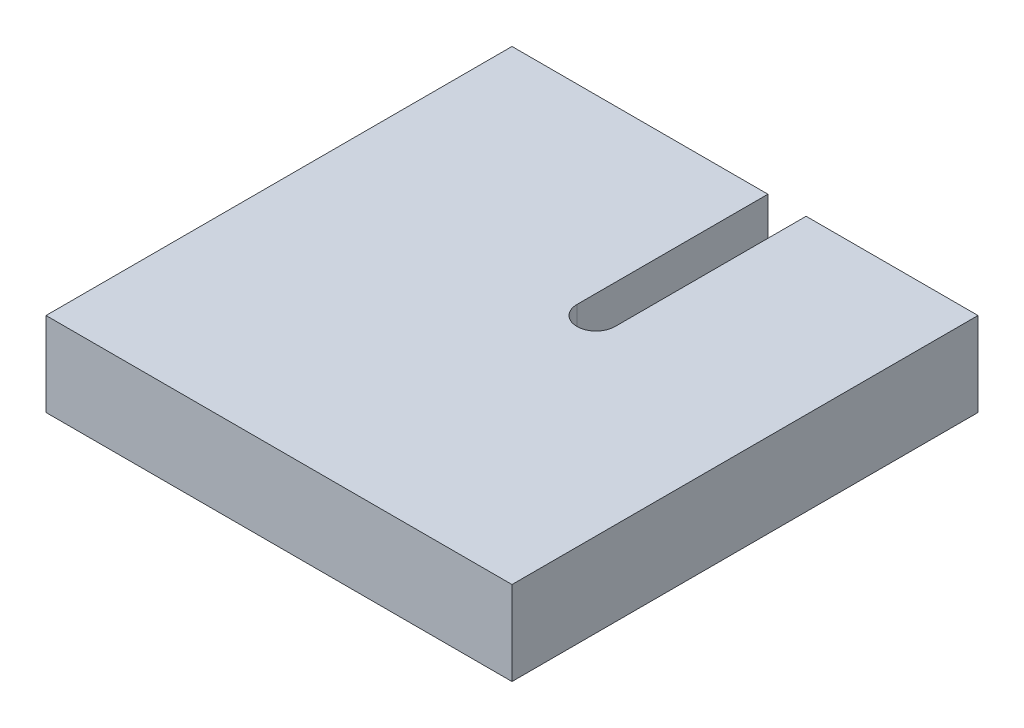
ISO-10303-21;
HEADER;
FILE_DESCRIPTION(('STEP AP214'),'2;1');
FILE_NAME('part.step','',(''),(''),'','','');
FILE_SCHEMA(('AUTOMOTIVE_DESIGN { 1 0 10303 214 1 1 1 1 }'));
ENDSEC;
DATA;
#1=APPLICATION_CONTEXT('core data for automotive mechanical design processes');
#2=APPLICATION_PROTOCOL_DEFINITION('international standard','automotive_design',2000,#1);
#3=PRODUCT_CONTEXT('',#1,'mechanical');
#4=PRODUCT('Part','Part','',(#3));
#5=PRODUCT_RELATED_PRODUCT_CATEGORY('part','',(#4));
#6=PRODUCT_DEFINITION_FORMATION('','',#4);
#7=PRODUCT_DEFINITION_CONTEXT('part definition',#1,'design');
#8=PRODUCT_DEFINITION('design','',#6,#7);
#9=PRODUCT_DEFINITION_SHAPE('','',#8);
#10=(LENGTH_UNIT() NAMED_UNIT(*) SI_UNIT(.MILLI.,.METRE.));
#11=(NAMED_UNIT(*) PLANE_ANGLE_UNIT() SI_UNIT($,.RADIAN.));
#12=(NAMED_UNIT(*) SI_UNIT($,.STERADIAN.) SOLID_ANGLE_UNIT());
#13=UNCERTAINTY_MEASURE_WITH_UNIT(LENGTH_MEASURE(1.E-05),#10,'distance_accuracy_value','');
#14=(GEOMETRIC_REPRESENTATION_CONTEXT(3) GLOBAL_UNCERTAINTY_ASSIGNED_CONTEXT((#13)) GLOBAL_UNIT_ASSIGNED_CONTEXT((#10,
#11,#12)) REPRESENTATION_CONTEXT('',''));
#15=CARTESIAN_POINT('',(0.,0.,0.));
#16=DIRECTION('',(0.,0.,1.));
#17=DIRECTION('',(1.,0.,0.));
#18=AXIS2_PLACEMENT_3D('',#15,#16,#17);
#19=CARTESIAN_POINT('',(-61.01,-0.01,61.));
#20=DIRECTION('',(0.,0.,1.));
#21=DIRECTION('',(1.,0.,0.));
#22=AXIS2_PLACEMENT_3D('',#19,#20,#21);
#23=PLANE('',#22);
#24=DIRECTION('',(1.,0.,0.));
#25=VECTOR('',#24,1.);
#26=CARTESIAN_POINT('',(0.,22.,61.));
#27=LINE('',#26,#25);
#28=CARTESIAN_POINT('',(-61.,22.,61.));
#29=VERTEX_POINT('',#28);
#30=CARTESIAN_POINT('',(61.,22.,61.));
#31=VERTEX_POINT('',#30);
#32=EDGE_CURVE('E139',#29,#31,#27,.T.);
#33=ORIENTED_EDGE('',*,*,#32,.F.);
#34=DIRECTION('',(0.,1.,0.));
#35=VECTOR('',#34,1.);
#36=CARTESIAN_POINT('',(-61.,11.,61.));
#37=LINE('',#36,#35);
#38=CARTESIAN_POINT('',(-61.,0.,61.));
#39=VERTEX_POINT('',#38);
#40=EDGE_CURVE('E152',#39,#29,#37,.T.);
#41=ORIENTED_EDGE('',*,*,#40,.F.);
#42=DIRECTION('',(-1.,0.,0.));
#43=VECTOR('',#42,1.);
#44=CARTESIAN_POINT('',(0.,0.,61.));
#45=LINE('',#44,#43);
#46=CARTESIAN_POINT('',(61.,0.,61.));
#47=VERTEX_POINT('',#46);
#48=EDGE_CURVE('E165',#47,#39,#45,.T.);
#49=ORIENTED_EDGE('',*,*,#48,.F.);
#50=DIRECTION('',(0.,-1.,0.));
#51=VECTOR('',#50,1.);
#52=CARTESIAN_POINT('',(61.,11.,61.));
#53=LINE('',#52,#51);
#54=EDGE_CURVE('E134',#31,#47,#53,.T.);
#55=ORIENTED_EDGE('',*,*,#54,.F.);
#56=EDGE_LOOP('',(#33,#41,#49,#55));
#57=FACE_BOUND('',#56,.T.);
#58=ADVANCED_FACE('F17',(#57),#23,.T.);
#59=CARTESIAN_POINT('',(61.,-0.01,61.01));
#60=DIRECTION('',(1.,0.,0.));
#61=DIRECTION('',(0.,0.,-1.));
#62=AXIS2_PLACEMENT_3D('',#59,#60,#61);
#63=PLANE('',#62);
#64=DIRECTION('',(0.,0.,-1.));
#65=VECTOR('',#64,1.);
#66=CARTESIAN_POINT('',(61.,22.,0.));
#67=LINE('',#66,#65);
#68=CARTESIAN_POINT('',(61.,22.,-61.));
#69=VERTEX_POINT('',#68);
#70=EDGE_CURVE('E130',#31,#69,#67,.T.);
#71=ORIENTED_EDGE('',*,*,#70,.F.);
#72=ORIENTED_EDGE('',*,*,#54,.T.);
#73=DIRECTION('',(0.,0.,1.));
#74=VECTOR('',#73,1.);
#75=CARTESIAN_POINT('',(61.,0.,0.));
#76=LINE('',#75,#74);
#77=CARTESIAN_POINT('',(61.,0.,-61.));
#78=VERTEX_POINT('',#77);
#79=EDGE_CURVE('E169',#78,#47,#76,.T.);
#80=ORIENTED_EDGE('',*,*,#79,.F.);
#81=DIRECTION('',(0.,-1.,0.));
#82=VECTOR('',#81,1.);
#83=CARTESIAN_POINT('',(61.,11.,-61.));
#84=LINE('',#83,#82);
#85=EDGE_CURVE('E123',#69,#78,#84,.T.);
#86=ORIENTED_EDGE('',*,*,#85,.F.);
#87=EDGE_LOOP('',(#71,#72,#80,#86));
#88=FACE_BOUND('',#87,.T.);
#89=ADVANCED_FACE('F194',(#88),#63,.T.);
#90=CARTESIAN_POINT('',(61.01,-0.01,-61.));
#91=DIRECTION('',(0.,0.,-1.));
#92=DIRECTION('',(-1.,0.,0.));
#93=AXIS2_PLACEMENT_3D('',#90,#91,#92);
#94=PLANE('',#93);
#95=DIRECTION('',(-1.,0.,0.));
#96=VECTOR('',#95,1.);
#97=CARTESIAN_POINT('',(0.,22.,-61.));
#98=LINE('',#97,#96);
#99=CARTESIAN_POINT('',(16.,22.,-61.));
#100=VERTEX_POINT('',#99);
#101=EDGE_CURVE('E126',#69,#100,#98,.T.);
#102=ORIENTED_EDGE('',*,*,#101,.F.);
#103=ORIENTED_EDGE('',*,*,#85,.T.);
#104=DIRECTION('',(1.,0.,0.));
#105=VECTOR('',#104,1.);
#106=CARTESIAN_POINT('',(0.,0.,-61.));
#107=LINE('',#106,#105);
#108=CARTESIAN_POINT('',(16.,0.,-61.));
#109=VERTEX_POINT('',#108);
#110=EDGE_CURVE('E174',#109,#78,#107,.T.);
#111=ORIENTED_EDGE('',*,*,#110,.F.);
#112=DIRECTION('',(0.,-1.,0.));
#113=VECTOR('',#112,1.);
#114=CARTESIAN_POINT('',(16.,11.,-61.));
#115=LINE('',#114,#113);
#116=EDGE_CURVE('E121',#100,#109,#115,.T.);
#117=ORIENTED_EDGE('',*,*,#116,.F.);
#118=EDGE_LOOP('',(#102,#103,#111,#117));
#119=FACE_BOUND('',#118,.T.);
#120=ADVANCED_FACE('F190',(#119),#94,.T.);
#121=CARTESIAN_POINT('',(16.,-0.01,-61.01));
#122=DIRECTION('',(-1.,0.,0.));
#123=DIRECTION('',(0.,0.,1.));
#124=AXIS2_PLACEMENT_3D('',#121,#122,#123);
#125=PLANE('',#124);
#126=DIRECTION('',(0.,0.,1.));
#127=VECTOR('',#126,1.);
#128=CARTESIAN_POINT('',(16.,22.,0.));
#129=LINE('',#128,#127);
#130=CARTESIAN_POINT('',(16.,22.,-11.));
#131=VERTEX_POINT('',#130);
#132=EDGE_CURVE('E129',#100,#131,#129,.T.);
#133=ORIENTED_EDGE('',*,*,#132,.F.);
#134=ORIENTED_EDGE('',*,*,#116,.T.);
#135=DIRECTION('',(0.,0.,-1.));
#136=VECTOR('',#135,1.);
#137=CARTESIAN_POINT('',(16.,0.,0.));
#138=LINE('',#137,#136);
#139=CARTESIAN_POINT('',(16.,0.,-11.));
#140=VERTEX_POINT('',#139);
#141=EDGE_CURVE('E90',#140,#109,#138,.T.);
#142=ORIENTED_EDGE('',*,*,#141,.F.);
#143=DIRECTION('',(0.,-1.,0.));
#144=VECTOR('',#143,1.);
#145=CARTESIAN_POINT('',(16.,11.,-11.));
#146=LINE('',#145,#144);
#147=EDGE_CURVE('E86',#131,#140,#146,.T.);
#148=ORIENTED_EDGE('',*,*,#147,.F.);
#149=EDGE_LOOP('',(#133,#134,#142,#148));
#150=FACE_BOUND('',#149,.T.);
#151=ADVANCED_FACE('F187',(#150),#125,.T.);
#152=CARTESIAN_POINT('',(11.,22.,-11.));
#153=DIRECTION('',(0.,-1.,0.));
#154=DIRECTION('',(0.,0.,-1.));
#155=AXIS2_PLACEMENT_3D('',#152,#153,#154);
#156=CYLINDRICAL_SURFACE('',#155,4.99999999999998);
#157=CARTESIAN_POINT('',(11.,22.,-11.));
#158=DIRECTION('',(0.,-1.,0.));
#159=DIRECTION('',(0.,0.,-1.));
#160=AXIS2_PLACEMENT_3D('',#157,#158,#159);
#161=CIRCLE('',#160,4.99999999999998);
#162=CARTESIAN_POINT('',(6.00000000000001,22.,-11.));
#163=VERTEX_POINT('',#162);
#164=EDGE_CURVE('E97',#131,#163,#161,.T.);
#165=ORIENTED_EDGE('',*,*,#164,.F.);
#166=ORIENTED_EDGE('',*,*,#147,.T.);
#167=CARTESIAN_POINT('',(11.,0.,-11.));
#168=DIRECTION('',(0.,-1.,0.));
#169=DIRECTION('',(0.,0.,-1.));
#170=AXIS2_PLACEMENT_3D('',#167,#168,#169);
#171=CIRCLE('',#170,4.99999999999998);
#172=CARTESIAN_POINT('',(6.00000000000001,0.,-11.));
#173=VERTEX_POINT('',#172);
#174=EDGE_CURVE('E21',#173,#140,#171,.F.);
#175=ORIENTED_EDGE('',*,*,#174,.F.);
#176=DIRECTION('',(0.,-1.,0.));
#177=VECTOR('',#176,1.);
#178=CARTESIAN_POINT('',(6.00000000000001,11.,-11.));
#179=LINE('',#178,#177);
#180=EDGE_CURVE('E85',#163,#173,#179,.T.);
#181=ORIENTED_EDGE('',*,*,#180,.F.);
#182=EDGE_LOOP('',(#165,#166,#175,#181));
#183=FACE_BOUND('',#182,.T.);
#184=ADVANCED_FACE('F83',(#183),#156,.F.);
#185=CARTESIAN_POINT('',(-61.01,0.,-61.01));
#186=DIRECTION('',(0.,-1.,0.));
#187=DIRECTION('',(1.,0.,0.));
#188=AXIS2_PLACEMENT_3D('',#185,#186,#187);
#189=PLANE('',#188);
#190=DIRECTION('',(0.,0.,1.));
#191=VECTOR('',#190,1.);
#192=CARTESIAN_POINT('',(-61.,0.,0.));
#193=LINE('',#192,#191);
#194=CARTESIAN_POINT('',(-61.,0.,-61.));
#195=VERTEX_POINT('',#194);
#196=EDGE_CURVE('E156',#195,#39,#193,.T.);
#197=ORIENTED_EDGE('',*,*,#196,.F.);
#198=DIRECTION('',(-1.,0.,0.));
#199=VECTOR('',#198,1.);
#200=CARTESIAN_POINT('',(-27.5,0.,-61.));
#201=LINE('',#200,#199);
#202=CARTESIAN_POINT('',(6.00000000000001,0.,-61.));
#203=VERTEX_POINT('',#202);
#204=EDGE_CURVE('E95',#203,#195,#201,.T.);
#205=ORIENTED_EDGE('',*,*,#204,.F.);
#206=DIRECTION('',(0.,0.,-1.));
#207=VECTOR('',#206,1.);
#208=CARTESIAN_POINT('',(6.00000000000001,0.,-36.));
#209=LINE('',#208,#207);
#210=EDGE_CURVE('E92',#173,#203,#209,.T.);
#211=ORIENTED_EDGE('',*,*,#210,.F.);
#212=ORIENTED_EDGE('',*,*,#174,.T.);
#213=ORIENTED_EDGE('',*,*,#141,.T.);
#214=ORIENTED_EDGE('',*,*,#110,.T.);
#215=ORIENTED_EDGE('',*,*,#79,.T.);
#216=ORIENTED_EDGE('',*,*,#48,.T.);
#217=EDGE_LOOP('',(#197,#205,#211,#212,#213,#214,#215,#216));
#218=FACE_BOUND('',#217,.T.);
#219=ADVANCED_FACE('F93',(#218),#189,.T.);
#220=CARTESIAN_POINT('',(-61.,-0.01,-61.01));
#221=DIRECTION('',(-1.,0.,0.));
#222=DIRECTION('',(0.,0.,1.));
#223=AXIS2_PLACEMENT_3D('',#220,#221,#222);
#224=PLANE('',#223);
#225=DIRECTION('',(0.,0.,1.));
#226=VECTOR('',#225,1.);
#227=CARTESIAN_POINT('',(-61.,22.,0.));
#228=LINE('',#227,#226);
#229=CARTESIAN_POINT('',(-61.,22.,-61.));
#230=VERTEX_POINT('',#229);
#231=EDGE_CURVE('E147',#230,#29,#228,.T.);
#232=ORIENTED_EDGE('',*,*,#231,.F.);
#233=DIRECTION('',(0.,1.,0.));
#234=VECTOR('',#233,1.);
#235=CARTESIAN_POINT('',(-61.,11.,-61.));
#236=LINE('',#235,#234);
#237=EDGE_CURVE('E101',#195,#230,#236,.T.);
#238=ORIENTED_EDGE('',*,*,#237,.F.);
#239=ORIENTED_EDGE('',*,*,#196,.T.);
#240=ORIENTED_EDGE('',*,*,#40,.T.);
#241=EDGE_LOOP('',(#232,#238,#239,#240));
#242=FACE_BOUND('',#241,.T.);
#243=ADVANCED_FACE('F201',(#242),#224,.T.);
#244=CARTESIAN_POINT('',(61.01,22.,-61.01));
#245=DIRECTION('',(0.,1.,0.));
#246=DIRECTION('',(-1.,0.,0.));
#247=AXIS2_PLACEMENT_3D('',#244,#245,#246);
#248=PLANE('',#247);
#249=ORIENTED_EDGE('',*,*,#132,.T.);
#250=ORIENTED_EDGE('',*,*,#164,.T.);
#251=DIRECTION('',(0.,0.,1.));
#252=VECTOR('',#251,1.);
#253=CARTESIAN_POINT('',(6.00000000000001,22.,-36.));
#254=LINE('',#253,#252);
#255=CARTESIAN_POINT('',(6.00000000000001,22.,-61.));
#256=VERTEX_POINT('',#255);
#257=EDGE_CURVE('E36',#256,#163,#254,.T.);
#258=ORIENTED_EDGE('',*,*,#257,.F.);
#259=DIRECTION('',(1.,0.,0.));
#260=VECTOR('',#259,1.);
#261=CARTESIAN_POINT('',(-27.5,22.,-61.));
#262=LINE('',#261,#260);
#263=EDGE_CURVE('E27',#230,#256,#262,.T.);
#264=ORIENTED_EDGE('',*,*,#263,.F.);
#265=ORIENTED_EDGE('',*,*,#231,.T.);
#266=ORIENTED_EDGE('',*,*,#32,.T.);
#267=ORIENTED_EDGE('',*,*,#70,.T.);
#268=ORIENTED_EDGE('',*,*,#101,.T.);
#269=EDGE_LOOP('',(#249,#250,#258,#264,#265,#266,#267,#268));
#270=FACE_BOUND('',#269,.T.);
#271=ADVANCED_FACE('F203',(#270),#248,.T.);
#272=CARTESIAN_POINT('',(6.00000000000001,-0.01,-10.99));
#273=DIRECTION('',(1.,0.,0.));
#274=DIRECTION('',(0.,0.,-1.));
#275=AXIS2_PLACEMENT_3D('',#272,#273,#274);
#276=PLANE('',#275);
#277=ORIENTED_EDGE('',*,*,#257,.T.);
#278=ORIENTED_EDGE('',*,*,#180,.T.);
#279=ORIENTED_EDGE('',*,*,#210,.T.);
#280=DIRECTION('',(0.,-1.,0.));
#281=VECTOR('',#280,1.);
#282=CARTESIAN_POINT('',(6.00000000000001,11.,-61.));
#283=LINE('',#282,#281);
#284=EDGE_CURVE('E11',#256,#203,#283,.T.);
#285=ORIENTED_EDGE('',*,*,#284,.F.);
#286=EDGE_LOOP('',(#277,#278,#279,#285));
#287=FACE_BOUND('',#286,.T.);
#288=ADVANCED_FACE('F99',(#287),#276,.T.);
#289=CARTESIAN_POINT('',(6.01000000000001,-0.01,-61.));
#290=DIRECTION('',(0.,0.,-1.));
#291=DIRECTION('',(-1.,0.,0.));
#292=AXIS2_PLACEMENT_3D('',#289,#290,#291);
#293=PLANE('',#292);
#294=ORIENTED_EDGE('',*,*,#263,.T.);
#295=ORIENTED_EDGE('',*,*,#284,.T.);
#296=ORIENTED_EDGE('',*,*,#204,.T.);
#297=ORIENTED_EDGE('',*,*,#237,.T.);
#298=EDGE_LOOP('',(#294,#295,#296,#297));
#299=FACE_BOUND('',#298,.T.);
#300=ADVANCED_FACE('F19',(#299),#293,.T.);
#301=CLOSED_SHELL('',(#58,#89,#120,#151,#184,#219,#243,#271,#288,#300));
#302=MANIFOLD_SOLID_BREP('B1',#301);
#303=ADVANCED_BREP_SHAPE_REPRESENTATION('',(#18,#302),#14);
#304=SHAPE_DEFINITION_REPRESENTATION(#9,#303);
ENDSEC;
END-ISO-10303-21;
